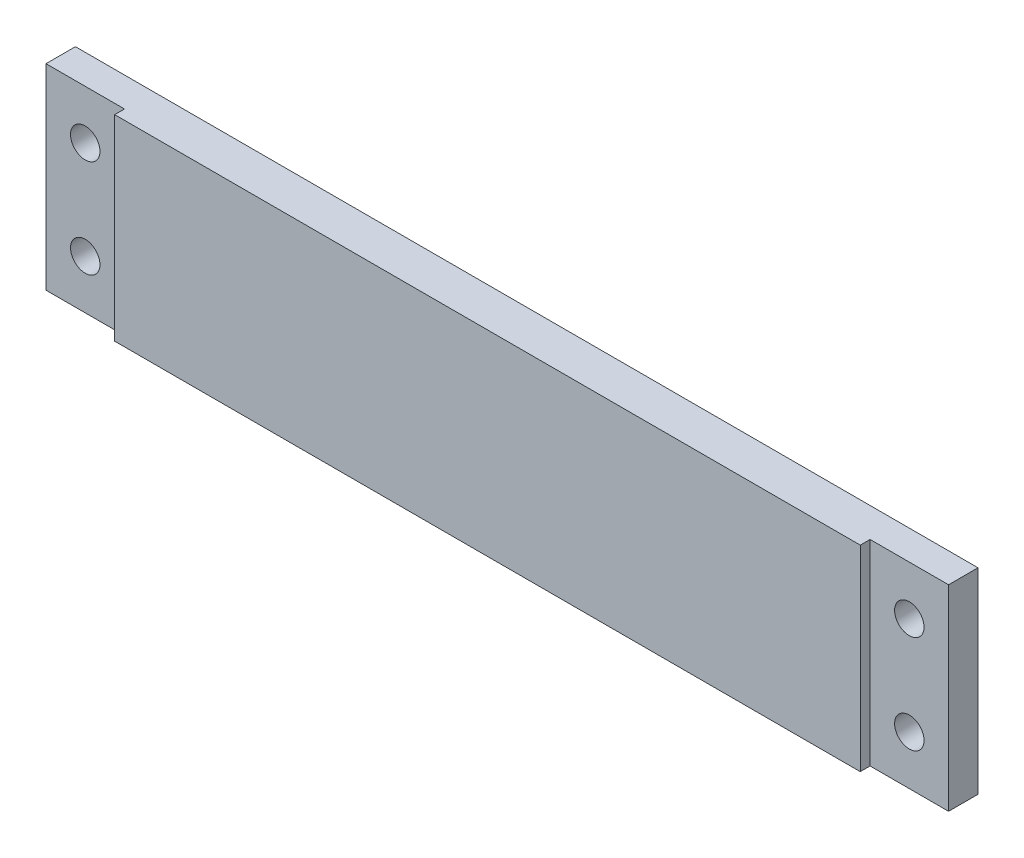
ISO-10303-21;
HEADER;
FILE_DESCRIPTION(('STEP AP214'),'2;1');
FILE_NAME('part.step','',(''),(''),'','','');
FILE_SCHEMA(('AUTOMOTIVE_DESIGN { 1 0 10303 214 1 1 1 1 }'));
ENDSEC;
DATA;
#1=APPLICATION_CONTEXT('core data for automotive mechanical design processes');
#2=APPLICATION_PROTOCOL_DEFINITION('international standard','automotive_design',2000,#1);
#3=PRODUCT_CONTEXT('',#1,'mechanical');
#4=PRODUCT('Part','Part','',(#3));
#5=PRODUCT_RELATED_PRODUCT_CATEGORY('part','',(#4));
#6=PRODUCT_DEFINITION_FORMATION('','',#4);
#7=PRODUCT_DEFINITION_CONTEXT('part definition',#1,'design');
#8=PRODUCT_DEFINITION('design','',#6,#7);
#9=PRODUCT_DEFINITION_SHAPE('','',#8);
#10=(LENGTH_UNIT() NAMED_UNIT(*) SI_UNIT(.MILLI.,.METRE.));
#11=(NAMED_UNIT(*) PLANE_ANGLE_UNIT() SI_UNIT($,.RADIAN.));
#12=(NAMED_UNIT(*) SI_UNIT($,.STERADIAN.) SOLID_ANGLE_UNIT());
#13=UNCERTAINTY_MEASURE_WITH_UNIT(LENGTH_MEASURE(1.E-05),#10,'distance_accuracy_value','');
#14=(GEOMETRIC_REPRESENTATION_CONTEXT(3) GLOBAL_UNCERTAINTY_ASSIGNED_CONTEXT((#13)) GLOBAL_UNIT_ASSIGNED_CONTEXT((#10,
#11,#12)) REPRESENTATION_CONTEXT('',''));
#15=CARTESIAN_POINT('',(0.,0.,0.));
#16=DIRECTION('',(0.,0.,1.));
#17=DIRECTION('',(1.,0.,0.));
#18=AXIS2_PLACEMENT_3D('',#15,#16,#17);
#19=CARTESIAN_POINT('',(0.,0.,4.));
#20=DIRECTION('',(1.,0.,0.));
#21=DIRECTION('',(0.,0.,-1.));
#22=AXIS2_PLACEMENT_3D('',#19,#20,#21);
#23=PLANE('',#22);
#24=DIRECTION('',(0.,-1.,0.));
#25=VECTOR('',#24,1.);
#26=CARTESIAN_POINT('',(0.,20.,3.));
#27=LINE('',#26,#25);
#28=CARTESIAN_POINT('',(0.,20.,3.));
#29=VERTEX_POINT('',#28);
#30=CARTESIAN_POINT('',(0.,0.,3.));
#31=VERTEX_POINT('',#30);
#32=EDGE_CURVE('E126',#29,#31,#27,.T.);
#33=ORIENTED_EDGE('',*,*,#32,.F.);
#34=DIRECTION('',(0.,0.,-1.));
#35=VECTOR('',#34,1.);
#36=CARTESIAN_POINT('',(0.,20.,4.));
#37=LINE('',#36,#35);
#38=CARTESIAN_POINT('',(0.,20.,0.));
#39=VERTEX_POINT('',#38);
#40=EDGE_CURVE('E161',#29,#39,#37,.T.);
#41=ORIENTED_EDGE('',*,*,#40,.T.);
#42=DIRECTION('',(0.,-1.,0.));
#43=VECTOR('',#42,1.);
#44=CARTESIAN_POINT('',(0.,0.,0.));
#45=LINE('',#44,#43);
#46=CARTESIAN_POINT('',(0.,0.,0.));
#47=VERTEX_POINT('',#46);
#48=EDGE_CURVE('E155',#39,#47,#45,.T.);
#49=ORIENTED_EDGE('',*,*,#48,.T.);
#50=DIRECTION('',(0.,0.,-1.));
#51=VECTOR('',#50,1.);
#52=CARTESIAN_POINT('',(0.,0.,4.));
#53=LINE('',#52,#51);
#54=EDGE_CURVE('E11',#31,#47,#53,.T.);
#55=ORIENTED_EDGE('',*,*,#54,.F.);
#56=EDGE_LOOP('',(#33,#41,#49,#55));
#57=FACE_BOUND('',#56,.T.);
#58=ADVANCED_FACE('F33',(#57),#23,.F.);
#59=CARTESIAN_POINT('',(4.,15.,4.));
#60=DIRECTION('',(0.,0.,-1.));
#61=DIRECTION('',(-1.,0.,0.));
#62=AXIS2_PLACEMENT_3D('',#59,#60,#61);
#63=CYLINDRICAL_SURFACE('',#62,1.5);
#64=CARTESIAN_POINT('',(4.,15.,0.));
#65=DIRECTION('',(0.,0.,1.));
#66=DIRECTION('',(1.,0.,0.));
#67=AXIS2_PLACEMENT_3D('',#64,#65,#66);
#68=CIRCLE('',#67,1.5);
#69=CARTESIAN_POINT('',(5.5,15.,0.));
#70=VERTEX_POINT('',#69);
#71=EDGE_CURVE('E152',#70,#70,#68,.T.);
#72=ORIENTED_EDGE('',*,*,#71,.F.);
#73=EDGE_LOOP('',(#72));
#74=FACE_BOUND('',#73,.T.);
#75=CARTESIAN_POINT('',(4.,15.,3.));
#76=DIRECTION('',(0.,0.,1.));
#77=DIRECTION('',(1.,0.,0.));
#78=AXIS2_PLACEMENT_3D('',#75,#76,#77);
#79=CIRCLE('',#78,1.5);
#80=CARTESIAN_POINT('',(5.5,15.,3.));
#81=VERTEX_POINT('',#80);
#82=EDGE_CURVE('E140',#81,#81,#79,.T.);
#83=ORIENTED_EDGE('',*,*,#82,.T.);
#84=EDGE_LOOP('',(#83));
#85=FACE_BOUND('',#84,.T.);
#86=ADVANCED_FACE('F221',(#74,#85),#63,.F.);
#87=CARTESIAN_POINT('',(4.,5.,4.));
#88=DIRECTION('',(0.,0.,-1.));
#89=DIRECTION('',(-1.,0.,0.));
#90=AXIS2_PLACEMENT_3D('',#87,#88,#89);
#91=CYLINDRICAL_SURFACE('',#90,1.5);
#92=CARTESIAN_POINT('',(4.,5.,0.));
#93=DIRECTION('',(0.,0.,1.));
#94=DIRECTION('',(1.,0.,0.));
#95=AXIS2_PLACEMENT_3D('',#92,#93,#94);
#96=CIRCLE('',#95,1.5);
#97=CARTESIAN_POINT('',(5.5,5.,0.));
#98=VERTEX_POINT('',#97);
#99=EDGE_CURVE('E149',#98,#98,#96,.T.);
#100=ORIENTED_EDGE('',*,*,#99,.F.);
#101=EDGE_LOOP('',(#100));
#102=FACE_BOUND('',#101,.T.);
#103=CARTESIAN_POINT('',(4.,5.,3.));
#104=DIRECTION('',(0.,0.,1.));
#105=DIRECTION('',(1.,0.,0.));
#106=AXIS2_PLACEMENT_3D('',#103,#104,#105);
#107=CIRCLE('',#106,1.5);
#108=CARTESIAN_POINT('',(5.5,5.,3.));
#109=VERTEX_POINT('',#108);
#110=EDGE_CURVE('E138',#109,#109,#107,.T.);
#111=ORIENTED_EDGE('',*,*,#110,.T.);
#112=EDGE_LOOP('',(#111));
#113=FACE_BOUND('',#112,.T.);
#114=ADVANCED_FACE('F178',(#102,#113),#91,.F.);
#115=CARTESIAN_POINT('',(0.,0.,4.));
#116=DIRECTION('',(0.,0.,-1.));
#117=DIRECTION('',(-1.,0.,0.));
#118=AXIS2_PLACEMENT_3D('',#115,#116,#117);
#119=PLANE('',#118);
#120=DIRECTION('',(1.,0.,0.));
#121=VECTOR('',#120,1.);
#122=CARTESIAN_POINT('',(0.,0.,4.));
#123=LINE('',#122,#121);
#124=CARTESIAN_POINT('',(8.,0.,4.));
#125=VERTEX_POINT('',#124);
#126=CARTESIAN_POINT('',(84.,0.,4.));
#127=VERTEX_POINT('',#126);
#128=EDGE_CURVE('E156',#125,#127,#123,.T.);
#129=ORIENTED_EDGE('',*,*,#128,.T.);
#130=DIRECTION('',(0.,-1.,0.));
#131=VECTOR('',#130,1.);
#132=CARTESIAN_POINT('',(84.,20.,4.));
#133=LINE('',#132,#131);
#134=CARTESIAN_POINT('',(84.,20.,4.));
#135=VERTEX_POINT('',#134);
#136=EDGE_CURVE('E205',#135,#127,#133,.T.);
#137=ORIENTED_EDGE('',*,*,#136,.F.);
#138=DIRECTION('',(-1.,0.,0.));
#139=VECTOR('',#138,1.);
#140=CARTESIAN_POINT('',(0.,20.,4.));
#141=LINE('',#140,#139);
#142=CARTESIAN_POINT('',(8.,20.,4.));
#143=VERTEX_POINT('',#142);
#144=EDGE_CURVE('E116',#135,#143,#141,.T.);
#145=ORIENTED_EDGE('',*,*,#144,.T.);
#146=DIRECTION('',(0.,1.,0.));
#147=VECTOR('',#146,1.);
#148=CARTESIAN_POINT('',(8.,20.,4.));
#149=LINE('',#148,#147);
#150=EDGE_CURVE('E125',#125,#143,#149,.T.);
#151=ORIENTED_EDGE('',*,*,#150,.F.);
#152=EDGE_LOOP('',(#129,#137,#145,#151));
#153=FACE_BOUND('',#152,.T.);
#154=ADVANCED_FACE('F209',(#153),#119,.F.);
#155=CARTESIAN_POINT('',(0.,0.,0.));
#156=DIRECTION('',(0.,0.,-1.));
#157=DIRECTION('',(-1.,0.,0.));
#158=AXIS2_PLACEMENT_3D('',#155,#156,#157);
#159=PLANE('',#158);
#160=CARTESIAN_POINT('',(88.,5.,0.));
#161=DIRECTION('',(0.,0.,1.));
#162=DIRECTION('',(1.,0.,0.));
#163=AXIS2_PLACEMENT_3D('',#160,#161,#162);
#164=CIRCLE('',#163,1.5);
#165=CARTESIAN_POINT('',(89.5,5.,0.));
#166=VERTEX_POINT('',#165);
#167=EDGE_CURVE('E146',#166,#166,#164,.T.);
#168=ORIENTED_EDGE('',*,*,#167,.T.);
#169=EDGE_LOOP('',(#168));
#170=FACE_BOUND('',#169,.T.);
#171=ORIENTED_EDGE('',*,*,#71,.T.);
#172=EDGE_LOOP('',(#171));
#173=FACE_BOUND('',#172,.T.);
#174=ORIENTED_EDGE('',*,*,#48,.F.);
#175=DIRECTION('',(-1.,0.,0.));
#176=VECTOR('',#175,1.);
#177=CARTESIAN_POINT('',(0.,20.,0.));
#178=LINE('',#177,#176);
#179=CARTESIAN_POINT('',(92.,20.,0.));
#180=VERTEX_POINT('',#179);
#181=EDGE_CURVE('E159',#180,#39,#178,.T.);
#182=ORIENTED_EDGE('',*,*,#181,.F.);
#183=DIRECTION('',(0.,1.,0.));
#184=VECTOR('',#183,1.);
#185=CARTESIAN_POINT('',(92.,0.,0.));
#186=LINE('',#185,#184);
#187=CARTESIAN_POINT('',(92.,0.,0.));
#188=VERTEX_POINT('',#187);
#189=EDGE_CURVE('E167',#188,#180,#186,.T.);
#190=ORIENTED_EDGE('',*,*,#189,.F.);
#191=DIRECTION('',(1.,0.,0.));
#192=VECTOR('',#191,1.);
#193=CARTESIAN_POINT('',(0.,0.,0.));
#194=LINE('',#193,#192);
#195=EDGE_CURVE('E164',#47,#188,#194,.T.);
#196=ORIENTED_EDGE('',*,*,#195,.F.);
#197=EDGE_LOOP('',(#174,#182,#190,#196));
#198=FACE_BOUND('',#197,.T.);
#199=ORIENTED_EDGE('',*,*,#99,.T.);
#200=EDGE_LOOP('',(#199));
#201=FACE_BOUND('',#200,.T.);
#202=CARTESIAN_POINT('',(88.,15.,0.));
#203=DIRECTION('',(0.,0.,1.));
#204=DIRECTION('',(1.,0.,0.));
#205=AXIS2_PLACEMENT_3D('',#202,#203,#204);
#206=CIRCLE('',#205,1.5);
#207=CARTESIAN_POINT('',(89.5,15.,0.));
#208=VERTEX_POINT('',#207);
#209=EDGE_CURVE('E143',#208,#208,#206,.T.);
#210=ORIENTED_EDGE('',*,*,#209,.T.);
#211=EDGE_LOOP('',(#210));
#212=FACE_BOUND('',#211,.T.);
#213=ADVANCED_FACE('F199',(#170,#173,#198,#201,#212),#159,.T.);
#214=CARTESIAN_POINT('',(0.,0.,4.));
#215=DIRECTION('',(0.,1.,0.));
#216=DIRECTION('',(0.,0.,1.));
#217=AXIS2_PLACEMENT_3D('',#214,#215,#216);
#218=PLANE('',#217);
#219=DIRECTION('',(1.,0.,0.));
#220=VECTOR('',#219,1.);
#221=CARTESIAN_POINT('',(92.,0.,3.));
#222=LINE('',#221,#220);
#223=CARTESIAN_POINT('',(84.,0.,3.));
#224=VERTEX_POINT('',#223);
#225=CARTESIAN_POINT('',(92.,0.,3.));
#226=VERTEX_POINT('',#225);
#227=EDGE_CURVE('E106',#224,#226,#222,.T.);
#228=ORIENTED_EDGE('',*,*,#227,.F.);
#229=DIRECTION('',(0.,0.,1.));
#230=VECTOR('',#229,1.);
#231=CARTESIAN_POINT('',(84.,0.,3.));
#232=LINE('',#231,#230);
#233=EDGE_CURVE('E104',#224,#127,#232,.T.);
#234=ORIENTED_EDGE('',*,*,#233,.T.);
#235=ORIENTED_EDGE('',*,*,#128,.F.);
#236=DIRECTION('',(0.,0.,1.));
#237=VECTOR('',#236,1.);
#238=CARTESIAN_POINT('',(8.,0.,3.));
#239=LINE('',#238,#237);
#240=CARTESIAN_POINT('',(8.,0.,3.));
#241=VERTEX_POINT('',#240);
#242=EDGE_CURVE('E133',#241,#125,#239,.T.);
#243=ORIENTED_EDGE('',*,*,#242,.F.);
#244=DIRECTION('',(1.,0.,0.));
#245=VECTOR('',#244,1.);
#246=CARTESIAN_POINT('',(0.,0.,3.));
#247=LINE('',#246,#245);
#248=EDGE_CURVE('E128',#31,#241,#247,.T.);
#249=ORIENTED_EDGE('',*,*,#248,.F.);
#250=ORIENTED_EDGE('',*,*,#54,.T.);
#251=ORIENTED_EDGE('',*,*,#195,.T.);
#252=DIRECTION('',(0.,0.,-1.));
#253=VECTOR('',#252,1.);
#254=CARTESIAN_POINT('',(92.,0.,4.));
#255=LINE('',#254,#253);
#256=EDGE_CURVE('E41',#226,#188,#255,.T.);
#257=ORIENTED_EDGE('',*,*,#256,.F.);
#258=EDGE_LOOP('',(#228,#234,#235,#243,#249,#250,#251,#257));
#259=FACE_BOUND('',#258,.T.);
#260=ADVANCED_FACE('F193',(#259),#218,.F.);
#261=CARTESIAN_POINT('',(92.,0.,4.));
#262=DIRECTION('',(-1.,0.,0.));
#263=DIRECTION('',(0.,0.,1.));
#264=AXIS2_PLACEMENT_3D('',#261,#262,#263);
#265=PLANE('',#264);
#266=DIRECTION('',(0.,0.,-1.));
#267=VECTOR('',#266,1.);
#268=CARTESIAN_POINT('',(92.,20.,4.));
#269=LINE('',#268,#267);
#270=CARTESIAN_POINT('',(92.,20.,3.));
#271=VERTEX_POINT('',#270);
#272=EDGE_CURVE('E173',#271,#180,#269,.T.);
#273=ORIENTED_EDGE('',*,*,#272,.F.);
#274=DIRECTION('',(0.,1.,0.));
#275=VECTOR('',#274,1.);
#276=CARTESIAN_POINT('',(92.,20.,3.));
#277=LINE('',#276,#275);
#278=EDGE_CURVE('E49',#226,#271,#277,.T.);
#279=ORIENTED_EDGE('',*,*,#278,.F.);
#280=ORIENTED_EDGE('',*,*,#256,.T.);
#281=ORIENTED_EDGE('',*,*,#189,.T.);
#282=EDGE_LOOP('',(#273,#279,#280,#281));
#283=FACE_BOUND('',#282,.T.);
#284=ADVANCED_FACE('F204',(#283),#265,.F.);
#285=CARTESIAN_POINT('',(0.,20.,4.));
#286=DIRECTION('',(0.,-1.,0.));
#287=DIRECTION('',(0.,0.,-1.));
#288=AXIS2_PLACEMENT_3D('',#285,#286,#287);
#289=PLANE('',#288);
#290=ORIENTED_EDGE('',*,*,#144,.F.);
#291=DIRECTION('',(0.,0.,1.));
#292=VECTOR('',#291,1.);
#293=CARTESIAN_POINT('',(84.,20.,3.));
#294=LINE('',#293,#292);
#295=CARTESIAN_POINT('',(84.,20.,3.));
#296=VERTEX_POINT('',#295);
#297=EDGE_CURVE('E101',#296,#135,#294,.T.);
#298=ORIENTED_EDGE('',*,*,#297,.F.);
#299=DIRECTION('',(-1.,0.,0.));
#300=VECTOR('',#299,1.);
#301=CARTESIAN_POINT('',(92.,20.,3.));
#302=LINE('',#301,#300);
#303=EDGE_CURVE('E107',#271,#296,#302,.T.);
#304=ORIENTED_EDGE('',*,*,#303,.F.);
#305=ORIENTED_EDGE('',*,*,#272,.T.);
#306=ORIENTED_EDGE('',*,*,#181,.T.);
#307=ORIENTED_EDGE('',*,*,#40,.F.);
#308=DIRECTION('',(-1.,0.,0.));
#309=VECTOR('',#308,1.);
#310=CARTESIAN_POINT('',(0.,20.,3.));
#311=LINE('',#310,#309);
#312=CARTESIAN_POINT('',(8.,20.,3.));
#313=VERTEX_POINT('',#312);
#314=EDGE_CURVE('E131',#313,#29,#311,.T.);
#315=ORIENTED_EDGE('',*,*,#314,.F.);
#316=DIRECTION('',(0.,0.,1.));
#317=VECTOR('',#316,1.);
#318=CARTESIAN_POINT('',(8.,20.,3.));
#319=LINE('',#318,#317);
#320=EDGE_CURVE('E136',#313,#143,#319,.T.);
#321=ORIENTED_EDGE('',*,*,#320,.T.);
#322=EDGE_LOOP('',(#290,#298,#304,#305,#306,#307,#315,#321));
#323=FACE_BOUND('',#322,.T.);
#324=ADVANCED_FACE('F114',(#323),#289,.F.);
#325=CARTESIAN_POINT('',(88.,5.,4.));
#326=DIRECTION('',(0.,0.,-1.));
#327=DIRECTION('',(-1.,0.,0.));
#328=AXIS2_PLACEMENT_3D('',#325,#326,#327);
#329=CYLINDRICAL_SURFACE('',#328,1.5);
#330=CARTESIAN_POINT('',(88.,5.,3.));
#331=DIRECTION('',(0.,0.,-1.));
#332=DIRECTION('',(-1.,0.,0.));
#333=AXIS2_PLACEMENT_3D('',#330,#331,#332);
#334=CIRCLE('',#333,1.5);
#335=CARTESIAN_POINT('',(86.5,5.,3.));
#336=VERTEX_POINT('',#335);
#337=EDGE_CURVE('E122',#336,#336,#334,.T.);
#338=ORIENTED_EDGE('',*,*,#337,.F.);
#339=EDGE_LOOP('',(#338));
#340=FACE_BOUND('',#339,.T.);
#341=ORIENTED_EDGE('',*,*,#167,.F.);
#342=EDGE_LOOP('',(#341));
#343=FACE_BOUND('',#342,.T.);
#344=ADVANCED_FACE('F217',(#340,#343),#329,.F.);
#345=CARTESIAN_POINT('',(88.,15.,4.));
#346=DIRECTION('',(0.,0.,-1.));
#347=DIRECTION('',(-1.,0.,0.));
#348=AXIS2_PLACEMENT_3D('',#345,#346,#347);
#349=CYLINDRICAL_SURFACE('',#348,1.5);
#350=CARTESIAN_POINT('',(88.,15.,3.));
#351=DIRECTION('',(0.,0.,-1.));
#352=DIRECTION('',(-1.,0.,0.));
#353=AXIS2_PLACEMENT_3D('',#350,#351,#352);
#354=CIRCLE('',#353,1.5);
#355=CARTESIAN_POINT('',(86.5,15.,3.));
#356=VERTEX_POINT('',#355);
#357=EDGE_CURVE('E36',#356,#356,#354,.T.);
#358=ORIENTED_EDGE('',*,*,#357,.F.);
#359=EDGE_LOOP('',(#358));
#360=FACE_BOUND('',#359,.T.);
#361=ORIENTED_EDGE('',*,*,#209,.F.);
#362=EDGE_LOOP('',(#361));
#363=FACE_BOUND('',#362,.T.);
#364=ADVANCED_FACE('F212',(#360,#363),#349,.F.);
#365=CARTESIAN_POINT('',(8.,20.,3.));
#366=DIRECTION('',(1.,0.,0.));
#367=DIRECTION('',(0.,1.,0.));
#368=AXIS2_PLACEMENT_3D('',#365,#366,#367);
#369=PLANE('',#368);
#370=ORIENTED_EDGE('',*,*,#150,.T.);
#371=ORIENTED_EDGE('',*,*,#320,.F.);
#372=DIRECTION('',(0.,1.,0.));
#373=VECTOR('',#372,1.);
#374=CARTESIAN_POINT('',(8.,20.,3.));
#375=LINE('',#374,#373);
#376=EDGE_CURVE('E57',#241,#313,#375,.T.);
#377=ORIENTED_EDGE('',*,*,#376,.F.);
#378=ORIENTED_EDGE('',*,*,#242,.T.);
#379=EDGE_LOOP('',(#370,#371,#377,#378));
#380=FACE_BOUND('',#379,.T.);
#381=ADVANCED_FACE('F182',(#380),#369,.F.);
#382=CARTESIAN_POINT('',(0.,0.,3.));
#383=DIRECTION('',(0.,0.,1.));
#384=DIRECTION('',(1.,0.,0.));
#385=AXIS2_PLACEMENT_3D('',#382,#383,#384);
#386=PLANE('',#385);
#387=ORIENTED_EDGE('',*,*,#82,.F.);
#388=EDGE_LOOP('',(#387));
#389=FACE_BOUND('',#388,.T.);
#390=ORIENTED_EDGE('',*,*,#110,.F.);
#391=EDGE_LOOP('',(#390));
#392=FACE_BOUND('',#391,.T.);
#393=ORIENTED_EDGE('',*,*,#32,.T.);
#394=ORIENTED_EDGE('',*,*,#248,.T.);
#395=ORIENTED_EDGE('',*,*,#376,.T.);
#396=ORIENTED_EDGE('',*,*,#314,.T.);
#397=EDGE_LOOP('',(#393,#394,#395,#396));
#398=FACE_BOUND('',#397,.T.);
#399=ADVANCED_FACE('F180',(#389,#392,#398),#386,.T.);
#400=CARTESIAN_POINT('',(84.,20.,3.));
#401=DIRECTION('',(-1.,0.,0.));
#402=DIRECTION('',(0.,0.,1.));
#403=AXIS2_PLACEMENT_3D('',#400,#401,#402);
#404=PLANE('',#403);
#405=ORIENTED_EDGE('',*,*,#136,.T.);
#406=ORIENTED_EDGE('',*,*,#233,.F.);
#407=DIRECTION('',(0.,-1.,0.));
#408=VECTOR('',#407,1.);
#409=CARTESIAN_POINT('',(84.,20.,3.));
#410=LINE('',#409,#408);
#411=EDGE_CURVE('E98',#296,#224,#410,.T.);
#412=ORIENTED_EDGE('',*,*,#411,.F.);
#413=ORIENTED_EDGE('',*,*,#297,.T.);
#414=EDGE_LOOP('',(#405,#406,#412,#413));
#415=FACE_BOUND('',#414,.T.);
#416=ADVANCED_FACE('F99',(#415),#404,.F.);
#417=CARTESIAN_POINT('',(0.,0.,3.));
#418=DIRECTION('',(0.,0.,-1.));
#419=DIRECTION('',(-1.,0.,0.));
#420=AXIS2_PLACEMENT_3D('',#417,#418,#419);
#421=PLANE('',#420);
#422=ORIENTED_EDGE('',*,*,#337,.T.);
#423=EDGE_LOOP('',(#422));
#424=FACE_BOUND('',#423,.T.);
#425=ORIENTED_EDGE('',*,*,#357,.T.);
#426=EDGE_LOOP('',(#425));
#427=FACE_BOUND('',#426,.T.);
#428=ORIENTED_EDGE('',*,*,#278,.T.);
#429=ORIENTED_EDGE('',*,*,#303,.T.);
#430=ORIENTED_EDGE('',*,*,#411,.T.);
#431=ORIENTED_EDGE('',*,*,#227,.T.);
#432=EDGE_LOOP('',(#428,#429,#430,#431));
#433=FACE_BOUND('',#432,.T.);
#434=ADVANCED_FACE('F109',(#424,#427,#433),#421,.F.);
#435=CLOSED_SHELL('',(#58,#86,#114,#154,#213,#260,#284,#324,#344,#364,#381,#399,#416,#434));
#436=MANIFOLD_SOLID_BREP('B2',#435);
#437=ADVANCED_BREP_SHAPE_REPRESENTATION('',(#18,#436),#14);
#438=SHAPE_DEFINITION_REPRESENTATION(#9,#437);
ENDSEC;
END-ISO-10303-21;
